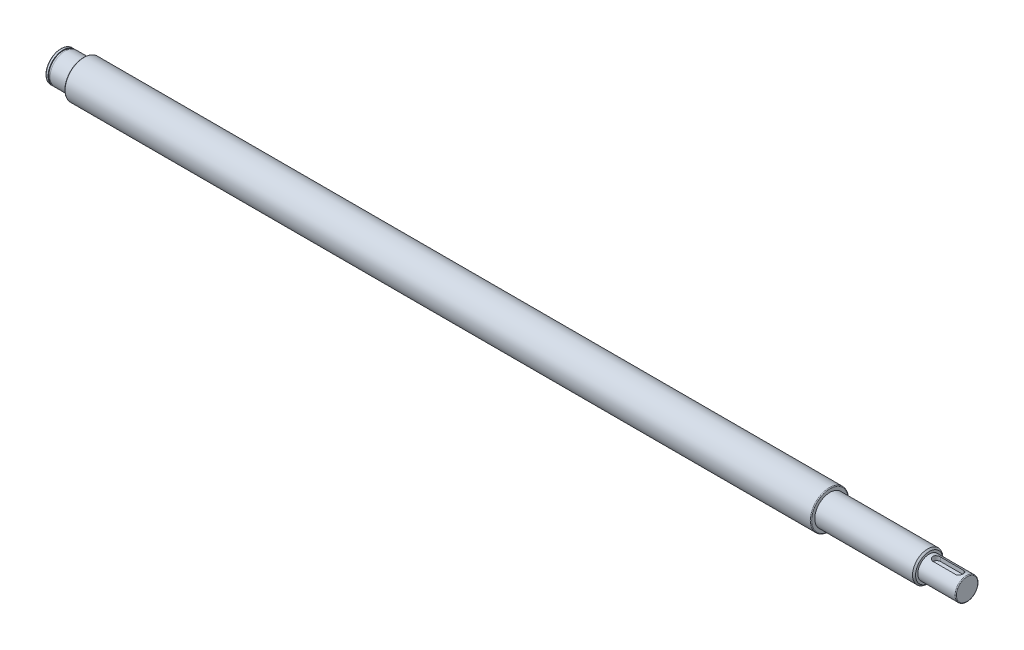
ISO-10303-21;
HEADER;
FILE_DESCRIPTION(('STEP AP214'),'2;1');
FILE_NAME('part.step','',(''),(''),'','','');
FILE_SCHEMA(('AUTOMOTIVE_DESIGN { 1 0 10303 214 1 1 1 1 }'));
ENDSEC;
DATA;
#1=APPLICATION_CONTEXT('core data for automotive mechanical design processes');
#2=APPLICATION_PROTOCOL_DEFINITION('international standard','automotive_design',2000,#1);
#3=PRODUCT_CONTEXT('',#1,'mechanical');
#4=PRODUCT('Part','Part','',(#3));
#5=PRODUCT_RELATED_PRODUCT_CATEGORY('part','',(#4));
#6=PRODUCT_DEFINITION_FORMATION('','',#4);
#7=PRODUCT_DEFINITION_CONTEXT('part definition',#1,'design');
#8=PRODUCT_DEFINITION('design','',#6,#7);
#9=PRODUCT_DEFINITION_SHAPE('','',#8);
#10=(LENGTH_UNIT() NAMED_UNIT(*) SI_UNIT(.MILLI.,.METRE.));
#11=(NAMED_UNIT(*) PLANE_ANGLE_UNIT() SI_UNIT($,.RADIAN.));
#12=(NAMED_UNIT(*) SI_UNIT($,.STERADIAN.) SOLID_ANGLE_UNIT());
#13=UNCERTAINTY_MEASURE_WITH_UNIT(LENGTH_MEASURE(1.E-05),#10,'distance_accuracy_value','');
#14=(GEOMETRIC_REPRESENTATION_CONTEXT(3) GLOBAL_UNCERTAINTY_ASSIGNED_CONTEXT((#13)) GLOBAL_UNIT_ASSIGNED_CONTEXT((#10,
#11,#12)) REPRESENTATION_CONTEXT('',''));
#15=CARTESIAN_POINT('',(0.,0.,0.));
#16=DIRECTION('',(0.,0.,1.));
#17=DIRECTION('',(1.,0.,0.));
#18=AXIS2_PLACEMENT_3D('',#15,#16,#17);
#19=CARTESIAN_POINT('',(0.,0.,0.));
#20=DIRECTION('',(-1.,0.,0.));
#21=DIRECTION('',(0.,0.,1.));
#22=AXIS2_PLACEMENT_3D('',#19,#20,#21);
#23=CYLINDRICAL_SURFACE('',#22,10.);
#24=CARTESIAN_POINT('',(3.,0.,0.));
#25=DIRECTION('',(1.,0.,0.));
#26=DIRECTION('',(0.,0.,-1.));
#27=AXIS2_PLACEMENT_3D('',#24,#25,#26);
#28=CIRCLE('',#27,10.);
#29=CARTESIAN_POINT('',(3.,0.,-10.));
#30=VERTEX_POINT('',#29);
#31=EDGE_CURVE('E74',#30,#30,#28,.T.);
#32=ORIENTED_EDGE('',*,*,#31,.T.);
#33=EDGE_LOOP('',(#32));
#34=FACE_BOUND('',#33,.T.);
#35=CARTESIAN_POINT('',(15.,0.,0.));
#36=DIRECTION('',(-1.,0.,0.));
#37=DIRECTION('',(0.,0.,1.));
#38=AXIS2_PLACEMENT_3D('',#35,#36,#37);
#39=CIRCLE('',#38,10.);
#40=CARTESIAN_POINT('',(15.,0.,10.));
#41=VERTEX_POINT('',#40);
#42=EDGE_CURVE('E115',#41,#41,#39,.T.);
#43=ORIENTED_EDGE('',*,*,#42,.T.);
#44=EDGE_LOOP('',(#43));
#45=FACE_BOUND('',#44,.T.);
#46=ADVANCED_FACE('F17',(#34,#45),#23,.T.);
#47=CARTESIAN_POINT('',(15.,10.,0.));
#48=DIRECTION('',(1.,0.,0.));
#49=DIRECTION('',(0.,0.,-1.));
#50=AXIS2_PLACEMENT_3D('',#47,#48,#49);
#51=PLANE('',#50);
#52=CARTESIAN_POINT('',(15.,0.,0.));
#53=DIRECTION('',(1.,0.,0.));
#54=DIRECTION('',(0.,0.,-1.));
#55=AXIS2_PLACEMENT_3D('',#52,#53,#54);
#56=CIRCLE('',#55,12.);
#57=CARTESIAN_POINT('',(15.,0.,-12.));
#58=VERTEX_POINT('',#57);
#59=EDGE_CURVE('E250',#58,#58,#56,.F.);
#60=ORIENTED_EDGE('',*,*,#59,.T.);
#61=EDGE_LOOP('',(#60));
#62=FACE_BOUND('',#61,.T.);
#63=ORIENTED_EDGE('',*,*,#42,.F.);
#64=EDGE_LOOP('',(#63));
#65=FACE_BOUND('',#64,.T.);
#66=ADVANCED_FACE('F163',(#62,#65),#51,.F.);
#67=CARTESIAN_POINT('',(0.,0.,0.));
#68=DIRECTION('',(-1.,0.,0.));
#69=DIRECTION('',(0.,0.,1.));
#70=AXIS2_PLACEMENT_3D('',#67,#68,#69);
#71=CYLINDRICAL_SURFACE('',#70,12.5);
#72=CARTESIAN_POINT('',(15.5,0.,0.));
#73=DIRECTION('',(1.,0.,0.));
#74=DIRECTION('',(0.,0.,-1.));
#75=AXIS2_PLACEMENT_3D('',#72,#73,#74);
#76=CIRCLE('',#75,12.5);
#77=CARTESIAN_POINT('',(15.5,0.,-12.5));
#78=VERTEX_POINT('',#77);
#79=EDGE_CURVE('E249',#78,#78,#76,.T.);
#80=ORIENTED_EDGE('',*,*,#79,.T.);
#81=EDGE_LOOP('',(#80));
#82=FACE_BOUND('',#81,.T.);
#83=CARTESIAN_POINT('',(507.,0.,0.));
#84=DIRECTION('',(-1.,0.,0.));
#85=DIRECTION('',(0.,0.,1.));
#86=AXIS2_PLACEMENT_3D('',#83,#84,#85);
#87=CIRCLE('',#86,12.5);
#88=CARTESIAN_POINT('',(507.,0.,12.5));
#89=VERTEX_POINT('',#88);
#90=EDGE_CURVE('E246',#89,#89,#87,.T.);
#91=ORIENTED_EDGE('',*,*,#90,.T.);
#92=EDGE_LOOP('',(#91));
#93=FACE_BOUND('',#92,.T.);
#94=ADVANCED_FACE('F170',(#82,#93),#71,.T.);
#95=CARTESIAN_POINT('',(507.5,12.5,0.));
#96=DIRECTION('',(-1.,0.,0.));
#97=DIRECTION('',(0.,0.,1.));
#98=AXIS2_PLACEMENT_3D('',#95,#96,#97);
#99=PLANE('',#98);
#100=CARTESIAN_POINT('',(507.5,0.,0.));
#101=DIRECTION('',(-1.,0.,0.));
#102=DIRECTION('',(0.,0.,1.));
#103=AXIS2_PLACEMENT_3D('',#100,#101,#102);
#104=CIRCLE('',#103,12.);
#105=CARTESIAN_POINT('',(507.5,0.,12.));
#106=VERTEX_POINT('',#105);
#107=EDGE_CURVE('E243',#106,#106,#104,.F.);
#108=ORIENTED_EDGE('',*,*,#107,.T.);
#109=EDGE_LOOP('',(#108));
#110=FACE_BOUND('',#109,.T.);
#111=CARTESIAN_POINT('',(507.5,0.,0.));
#112=DIRECTION('',(-1.,0.,0.));
#113=DIRECTION('',(0.,0.,1.));
#114=AXIS2_PLACEMENT_3D('',#111,#112,#113);
#115=CIRCLE('',#114,10.);
#116=CARTESIAN_POINT('',(507.5,0.,10.));
#117=VERTEX_POINT('',#116);
#118=EDGE_CURVE('E111',#117,#117,#115,.T.);
#119=ORIENTED_EDGE('',*,*,#118,.T.);
#120=EDGE_LOOP('',(#119));
#121=FACE_BOUND('',#120,.T.);
#122=ADVANCED_FACE('F279',(#110,#121),#99,.F.);
#123=CARTESIAN_POINT('',(0.,0.,0.));
#124=DIRECTION('',(-1.,0.,0.));
#125=DIRECTION('',(0.,0.,1.));
#126=AXIS2_PLACEMENT_3D('',#123,#124,#125);
#127=CYLINDRICAL_SURFACE('',#126,10.);
#128=CARTESIAN_POINT('',(572.,0.,0.));
#129=DIRECTION('',(-1.,0.,0.));
#130=DIRECTION('',(0.,0.,1.));
#131=AXIS2_PLACEMENT_3D('',#128,#129,#130);
#132=CIRCLE('',#131,10.);
#133=CARTESIAN_POINT('',(572.,0.,10.));
#134=VERTEX_POINT('',#133);
#135=EDGE_CURVE('E438',#134,#134,#132,.T.);
#136=ORIENTED_EDGE('',*,*,#135,.T.);
#137=EDGE_LOOP('',(#136));
#138=FACE_BOUND('',#137,.T.);
#139=ORIENTED_EDGE('',*,*,#118,.F.);
#140=EDGE_LOOP('',(#139));
#141=FACE_BOUND('',#140,.T.);
#142=ADVANCED_FACE('F273',(#138,#141),#127,.T.);
#143=CARTESIAN_POINT('',(573.,10.,0.));
#144=DIRECTION('',(-1.,0.,0.));
#145=DIRECTION('',(0.,0.,1.));
#146=AXIS2_PLACEMENT_3D('',#143,#144,#145);
#147=PLANE('',#146);
#148=CARTESIAN_POINT('',(573.,0.,0.));
#149=DIRECTION('',(-1.,0.,0.));
#150=DIRECTION('',(0.,0.,1.));
#151=AXIS2_PLACEMENT_3D('',#148,#149,#150);
#152=CIRCLE('',#151,8.9999999999999);
#153=CARTESIAN_POINT('',(573.,0.,8.9999999999999));
#154=VERTEX_POINT('',#153);
#155=EDGE_CURVE('E257',#154,#154,#152,.F.);
#156=ORIENTED_EDGE('',*,*,#155,.T.);
#157=EDGE_LOOP('',(#156));
#158=FACE_BOUND('',#157,.T.);
#159=CARTESIAN_POINT('',(573.,0.,0.));
#160=DIRECTION('',(-1.,0.,0.));
#161=DIRECTION('',(0.,0.,1.));
#162=AXIS2_PLACEMENT_3D('',#159,#160,#161);
#163=CIRCLE('',#162,7.5);
#164=CARTESIAN_POINT('',(573.,0.,7.5));
#165=VERTEX_POINT('',#164);
#166=EDGE_CURVE('E102',#165,#165,#163,.T.);
#167=ORIENTED_EDGE('',*,*,#166,.T.);
#168=EDGE_LOOP('',(#167));
#169=FACE_BOUND('',#168,.T.);
#170=ADVANCED_FACE('F160',(#158,#169),#147,.F.);
#171=CARTESIAN_POINT('',(0.,0.,0.));
#172=DIRECTION('',(-1.,0.,0.));
#173=DIRECTION('',(0.,0.,1.));
#174=AXIS2_PLACEMENT_3D('',#171,#172,#173);
#175=CYLINDRICAL_SURFACE('',#174,7.5);
#176=CARTESIAN_POINT('',(597.5,0.,0.));
#177=DIRECTION('',(-1.,0.,0.));
#178=DIRECTION('',(0.,0.,1.));
#179=AXIS2_PLACEMENT_3D('',#176,#177,#178);
#180=CIRCLE('',#179,7.5);
#181=CARTESIAN_POINT('',(597.5,0.,7.5));
#182=VERTEX_POINT('',#181);
#183=EDGE_CURVE('E25',#182,#182,#180,.T.);
#184=ORIENTED_EDGE('',*,*,#183,.T.);
#185=EDGE_LOOP('',(#184));
#186=FACE_BOUND('',#185,.T.);
#187=DIRECTION('',(-1.,0.,0.));
#188=VECTOR('',#187,1.);
#189=CARTESIAN_POINT('',(0.,7.07106781186549,-2.49999999999997));
#190=LINE('',#189,#188);
#191=CARTESIAN_POINT('',(578.,7.07106781186549,-2.5));
#192=VERTEX_POINT('',#191);
#193=CARTESIAN_POINT('',(593.,7.07106781186547,-2.5));
#194=VERTEX_POINT('',#193);
#195=EDGE_CURVE('E40',#192,#194,#190,.F.);
#196=ORIENTED_EDGE('',*,*,#195,.T.);
#197=CARTESIAN_POINT('',(593.,7.07106781186547,-2.5));
#198=CARTESIAN_POINT('',(593.06820707782,7.07105693273157,-2.50000899110405));
#199=CARTESIAN_POINT('',(593.136408074676,7.07205443904569,-2.49720887221585));
#200=CARTESIAN_POINT('',(593.272281038349,7.07598524121008,-2.4860604578047));
#201=CARTESIAN_POINT('',(593.339953142988,7.07891801450643,-2.47771365997201));
#202=CARTESIAN_POINT('',(593.474090488355,7.08662705252508,-2.45557459422793));
#203=CARTESIAN_POINT('',(593.540558702551,7.0913978485012,-2.44179847763131));
#204=CARTESIAN_POINT('',(593.672008268583,7.10262619906003,-2.40894181030118));
#205=CARTESIAN_POINT('',(593.73698956659,7.10908381460331,-2.38986106786033));
#206=CARTESIAN_POINT('',(593.928961579715,7.13069940793912,-2.32491551306197));
#207=CARTESIAN_POINT('',(594.05317915747,7.14811243884055,-2.27131416810238));
#208=CARTESIAN_POINT('',(594.290876811464,7.18697034087523,-2.14517784106245));
#209=CARTESIAN_POINT('',(594.404350235781,7.20841768551075,-2.07263123268537));
#210=CARTESIAN_POINT('',(594.621792903471,7.25386182389477,-1.90762995846821));
#211=CARTESIAN_POINT('',(594.725285142768,7.2779218942807,-1.81456284630818));
#212=CARTESIAN_POINT('',(594.915517103234,7.32534626726043,-1.61247071190493));
#213=CARTESIAN_POINT('',(595.002253841319,7.3487104453352,-1.50344285413652));
#214=CARTESIAN_POINT('',(595.158698224263,7.39284706096344,-1.26900922493973));
#215=CARTESIAN_POINT('',(595.227902307742,7.41353593532889,-1.14325025284455));
#216=CARTESIAN_POINT('',(595.343980782435,7.4492402188328,-0.8810730954752));
#217=CARTESIAN_POINT('',(595.390861994926,7.46425736081205,-0.744658181225826));
#218=CARTESIAN_POINT('',(595.459339276258,7.48647677762783,-0.47007337118288));
#219=CARTESIAN_POINT('',(595.481758170957,7.49393272446142,-0.332129588153714));
#220=CARTESIAN_POINT('',(595.503290756739,7.50109021034827,-0.0542474216361666));
#221=CARTESIAN_POINT('',(595.502410000916,7.50079359709905,0.0856904786402524));
#222=CARTESIAN_POINT('',(595.4778892896,7.49265096581776,0.357759612692359));
#223=CARTESIAN_POINT('',(595.455143404395,7.48510152476447,0.489981756428048));
#224=CARTESIAN_POINT('',(595.389017004021,7.46367401253772,0.748610161077215));
#225=CARTESIAN_POINT('',(595.345635344675,7.44979559044789,0.875016099077747));
#226=CARTESIAN_POINT('',(595.238946575806,7.41689170677794,1.12038155754031));
#227=CARTESIAN_POINT('',(595.175384887143,7.39780094595659,1.23922126412485));
#228=CARTESIAN_POINT('',(595.030350121575,7.35645969200238,1.4648114727535));
#229=CARTESIAN_POINT('',(594.948872172398,7.33420833994017,1.57155867428944));
#230=CARTESIAN_POINT('',(594.765822374993,7.28765679856813,1.77524334927518));
#231=CARTESIAN_POINT('',(594.663486140972,7.2633094669978,1.87148402903081));
#232=CARTESIAN_POINT('',(594.443896275714,7.21618726182143,2.04568006205152));
#233=CARTESIAN_POINT('',(594.326637843993,7.19341289789387,2.12362950795968));
#234=CARTESIAN_POINT('',(594.078299554116,7.1517507844079,2.26000831398181));
#235=CARTESIAN_POINT('',(593.947041212668,7.13292537370585,2.31813252376916));
#236=CARTESIAN_POINT('',(593.675882556025,7.10202742655099,2.41115057675281));
#237=CARTESIAN_POINT('',(593.53599626657,7.08994423522483,2.44608109013839));
#238=CARTESIAN_POINT('',(593.32895340813,7.078413552368,2.47914539070207));
#239=CARTESIAN_POINT('',(593.263396525364,7.07566669236505,2.48696265313779));
#240=CARTESIAN_POINT('',(593.131904804,7.07199258928497,2.497386540178));
#241=CARTESIAN_POINT('',(593.065970563639,7.0710629982382,2.49999988848745));
#242=CARTESIAN_POINT('',(593.,7.07106781186548,2.5));
#243=B_SPLINE_CURVE_WITH_KNOTS('',3,(#197,#198,#199,#200,#201,#202,#203,#204,#205,#206,#207,
#208,#209,#210,#211,#212,#213,#214,#215,#216,#217,#218,#219,#220,#221,#222,#223,#224,#225,#226,
#227,#228,#229,#230,#231,#232,#233,#234,#235,#236,#237,#238,#239,#240,#241,#242),.UNSPECIFIED.,
.F.,.F.,(4,2,2,2,2,2,2,2,2,2,2,2,2,2,2,2,2,2,2,2,2,2,4),(0.,0.204546211838768,0.409037215423831,
0.612924429429257,0.816819012805585,1.22401016923283,1.63145179965567,2.05327864088414,
2.47518051341089,2.90809434014468,3.34087579484531,3.75860278500218,4.17623021758312,
4.5774764784604,4.97874498952319,5.38529148746617,5.79194868153616,6.21771736826816,
6.64362337304799,7.07581676501824,7.50732520398836,7.70536340013626,7.90314555504367),.UNSPECIFIED.);
#244=CARTESIAN_POINT('',(593.,7.07106781186547,2.5));
#245=VERTEX_POINT('',#244);
#246=EDGE_CURVE('E118',#194,#245,#243,.T.);
#247=ORIENTED_EDGE('',*,*,#246,.T.);
#248=DIRECTION('',(-1.,0.,0.));
#249=VECTOR('',#248,1.);
#250=CARTESIAN_POINT('',(0.,7.07106781186547,2.5));
#251=LINE('',#250,#249);
#252=CARTESIAN_POINT('',(578.,7.07106781186547,2.5));
#253=VERTEX_POINT('',#252);
#254=EDGE_CURVE('E437',#245,#253,#251,.T.);
#255=ORIENTED_EDGE('',*,*,#254,.T.);
#256=CARTESIAN_POINT('',(578.,7.07106781186548,2.5));
#257=CARTESIAN_POINT('',(577.93179292218,7.07105693273158,2.50000899110404));
#258=CARTESIAN_POINT('',(577.863591925324,7.0720544390457,2.49720887221583));
#259=CARTESIAN_POINT('',(577.727718961651,7.07598524121008,2.48606045780469));
#260=CARTESIAN_POINT('',(577.660046857012,7.07891801450643,2.477713659972));
#261=CARTESIAN_POINT('',(577.525909511645,7.08662705252508,2.45557459422791));
#262=CARTESIAN_POINT('',(577.459441297449,7.09139784850121,2.44179847763129));
#263=CARTESIAN_POINT('',(577.327991731417,7.10262619906004,2.40894181030116));
#264=CARTESIAN_POINT('',(577.26301043341,7.10908381460331,2.38986106786031));
#265=CARTESIAN_POINT('',(577.071038420285,7.13069940793911,2.32491551306195));
#266=CARTESIAN_POINT('',(576.94682084253,7.14811243884055,2.27131416810237));
#267=CARTESIAN_POINT('',(576.709123188536,7.18697034087524,2.14517784106243));
#268=CARTESIAN_POINT('',(576.595649764219,7.20841768551076,2.07263123268534));
#269=CARTESIAN_POINT('',(576.378207096529,7.25386182389479,1.90762995846818));
#270=CARTESIAN_POINT('',(576.274714857232,7.27792189428071,1.81456284630814));
#271=CARTESIAN_POINT('',(576.084482896766,7.32534626726043,1.61247071190489));
#272=CARTESIAN_POINT('',(575.997746158681,7.3487104453352,1.50344285413648));
#273=CARTESIAN_POINT('',(575.841301775737,7.39284706096344,1.26900922493969));
#274=CARTESIAN_POINT('',(575.772097692258,7.41353593532889,1.1432502528445));
#275=CARTESIAN_POINT('',(575.656019217565,7.4492402188328,0.881073095475156));
#276=CARTESIAN_POINT('',(575.609138005074,7.46425736081205,0.744658181225797));
#277=CARTESIAN_POINT('',(575.540660723742,7.48647677762783,0.470073371182869));
#278=CARTESIAN_POINT('',(575.518241829043,7.49393272446142,0.332129588153705));
#279=CARTESIAN_POINT('',(575.496709243261,7.50109021034827,0.0542474216361628));
#280=CARTESIAN_POINT('',(575.497589999084,7.50079359709905,-0.0856904786402541));
#281=CARTESIAN_POINT('',(575.5221107104,7.49265096581776,-0.357759612692388));
#282=CARTESIAN_POINT('',(575.544856595605,7.48510152476447,-0.489981756428104));
#283=CARTESIAN_POINT('',(575.610982995979,7.46367401253772,-0.748610161077275));
#284=CARTESIAN_POINT('',(575.654364655325,7.44979559044789,-0.875016099077785));
#285=CARTESIAN_POINT('',(575.761053424194,7.41689170677794,-1.12038155754031));
#286=CARTESIAN_POINT('',(575.824615112857,7.3978009459566,-1.23922126412483));
#287=CARTESIAN_POINT('',(575.969649878425,7.35645969200239,-1.46481147275349));
#288=CARTESIAN_POINT('',(576.051127827602,7.33420833994016,-1.57155867428944));
#289=CARTESIAN_POINT('',(576.234177625007,7.28765679856812,-1.77524334927523));
#290=CARTESIAN_POINT('',(576.336513859028,7.26330946699779,-1.87148402903086));
#291=CARTESIAN_POINT('',(576.556103724286,7.21618726182142,-2.04568006205156));
#292=CARTESIAN_POINT('',(576.673362156007,7.19341289789386,-2.12362950795971));
#293=CARTESIAN_POINT('',(576.921700445884,7.15175078440789,-2.26000831398183));
#294=CARTESIAN_POINT('',(577.052958787332,7.13292537370585,-2.31813252376918));
#295=CARTESIAN_POINT('',(577.324117443975,7.10202742655099,-2.41115057675283));
#296=CARTESIAN_POINT('',(577.46400373343,7.08994423522482,-2.4460810901384));
#297=CARTESIAN_POINT('',(577.67104659187,7.07841355236799,-2.47914539070208));
#298=CARTESIAN_POINT('',(577.736603474636,7.07566669236504,-2.4869626531378));
#299=CARTESIAN_POINT('',(577.868095196,7.07199258928497,-2.49738654017801));
#300=CARTESIAN_POINT('',(577.934029436361,7.0710629982382,-2.49999988848746));
#301=CARTESIAN_POINT('',(578.,7.07106781186547,-2.5));
#302=B_SPLINE_CURVE_WITH_KNOTS('',3,(#256,#257,#258,#259,#260,#261,#262,#263,#264,#265,#266,
#267,#268,#269,#270,#271,#272,#273,#274,#275,#276,#277,#278,#279,#280,#281,#282,#283,#284,#285,
#286,#287,#288,#289,#290,#291,#292,#293,#294,#295,#296,#297,#298,#299,#300,#301),.UNSPECIFIED.,
.F.,.F.,(4,2,2,2,2,2,2,2,2,2,2,2,2,2,2,2,2,2,2,2,2,2,4),(0.,0.204546211838657,0.409037215423831,
0.612924429429258,0.816819012805586,1.22401016923283,1.63145179965567,2.05327864088426,
2.4751805134109,2.90809434014472,3.34087579484532,3.75860278500216,4.17623021758313,
4.57747647846042,4.97874498952316,5.3852914874661,5.79194868153613,6.21771736826825,
6.64362337304795,7.0758167650182,7.50732520398832,7.70536340013611,7.90314555504363),.UNSPECIFIED.);
#303=EDGE_CURVE('E32',#253,#192,#302,.T.);
#304=ORIENTED_EDGE('',*,*,#303,.T.);
#305=EDGE_LOOP('',(#196,#247,#255,#304));
#306=FACE_BOUND('',#305,.T.);
#307=ORIENTED_EDGE('',*,*,#166,.F.);
#308=EDGE_LOOP('',(#307));
#309=FACE_BOUND('',#308,.T.);
#310=ADVANCED_FACE('F133',(#186,#306,#309),#175,.T.);
#311=CARTESIAN_POINT('',(598.,7.5,0.));
#312=DIRECTION('',(-1.,0.,0.));
#313=DIRECTION('',(0.,0.,1.));
#314=AXIS2_PLACEMENT_3D('',#311,#312,#313);
#315=PLANE('',#314);
#316=CARTESIAN_POINT('',(598.,0.,0.));
#317=DIRECTION('',(-1.,0.,0.));
#318=DIRECTION('',(0.,0.,1.));
#319=AXIS2_PLACEMENT_3D('',#316,#317,#318);
#320=CIRCLE('',#319,7.);
#321=CARTESIAN_POINT('',(598.,0.,7.));
#322=VERTEX_POINT('',#321);
#323=EDGE_CURVE('E11',#322,#322,#320,.F.);
#324=ORIENTED_EDGE('',*,*,#323,.T.);
#325=EDGE_LOOP('',(#324));
#326=FACE_BOUND('',#325,.T.);
#327=ADVANCED_FACE('F152',(#326),#315,.F.);
#328=CARTESIAN_POINT('',(578.,4.5,0.));
#329=DIRECTION('',(0.,1.,0.));
#330=DIRECTION('',(0.,0.,1.));
#331=AXIS2_PLACEMENT_3D('',#328,#329,#330);
#332=CYLINDRICAL_SURFACE('',#331,2.5);
#333=DIRECTION('',(0.,1.,0.));
#334=VECTOR('',#333,1.);
#335=CARTESIAN_POINT('',(578.,4.5,2.5));
#336=LINE('',#335,#334);
#337=CARTESIAN_POINT('',(578.,4.5,2.5));
#338=VERTEX_POINT('',#337);
#339=EDGE_CURVE('E99',#338,#253,#336,.T.);
#340=ORIENTED_EDGE('',*,*,#339,.F.);
#341=CARTESIAN_POINT('',(578.,4.5,0.));
#342=DIRECTION('',(0.,1.,0.));
#343=DIRECTION('',(0.,0.,1.));
#344=AXIS2_PLACEMENT_3D('',#341,#342,#343);
#345=CIRCLE('',#344,2.5);
#346=CARTESIAN_POINT('',(578.,4.5,-2.5));
#347=VERTEX_POINT('',#346);
#348=EDGE_CURVE('E87',#347,#338,#345,.T.);
#349=ORIENTED_EDGE('',*,*,#348,.F.);
#350=DIRECTION('',(0.,1.,0.));
#351=VECTOR('',#350,1.);
#352=CARTESIAN_POINT('',(578.,4.5,-2.5));
#353=LINE('',#352,#351);
#354=EDGE_CURVE('E100',#347,#192,#353,.T.);
#355=ORIENTED_EDGE('',*,*,#354,.T.);
#356=ORIENTED_EDGE('',*,*,#303,.F.);
#357=EDGE_LOOP('',(#340,#349,#355,#356));
#358=FACE_BOUND('',#357,.T.);
#359=ADVANCED_FACE('F149',(#358),#332,.F.);
#360=CARTESIAN_POINT('',(578.,4.5,-2.5));
#361=DIRECTION('',(0.,0.,-1.));
#362=DIRECTION('',(-1.,0.,0.));
#363=AXIS2_PLACEMENT_3D('',#360,#361,#362);
#364=PLANE('',#363);
#365=ORIENTED_EDGE('',*,*,#354,.F.);
#366=DIRECTION('',(-1.,0.,0.));
#367=VECTOR('',#366,1.);
#368=CARTESIAN_POINT('',(578.,4.5,-2.5));
#369=LINE('',#368,#367);
#370=CARTESIAN_POINT('',(593.,4.5,-2.5));
#371=VERTEX_POINT('',#370);
#372=EDGE_CURVE('E96',#371,#347,#369,.T.);
#373=ORIENTED_EDGE('',*,*,#372,.F.);
#374=DIRECTION('',(0.,1.,0.));
#375=VECTOR('',#374,1.);
#376=CARTESIAN_POINT('',(593.,4.5,-2.5));
#377=LINE('',#376,#375);
#378=EDGE_CURVE('E103',#371,#194,#377,.T.);
#379=ORIENTED_EDGE('',*,*,#378,.T.);
#380=ORIENTED_EDGE('',*,*,#195,.F.);
#381=EDGE_LOOP('',(#365,#373,#379,#380));
#382=FACE_BOUND('',#381,.T.);
#383=ADVANCED_FACE('F143',(#382),#364,.F.);
#384=CARTESIAN_POINT('',(593.,4.5,0.));
#385=DIRECTION('',(0.,1.,0.));
#386=DIRECTION('',(0.,0.,1.));
#387=AXIS2_PLACEMENT_3D('',#384,#385,#386);
#388=CYLINDRICAL_SURFACE('',#387,2.5);
#389=ORIENTED_EDGE('',*,*,#378,.F.);
#390=CARTESIAN_POINT('',(593.,4.5,0.));
#391=DIRECTION('',(0.,1.,0.));
#392=DIRECTION('',(0.,0.,1.));
#393=AXIS2_PLACEMENT_3D('',#390,#391,#392);
#394=CIRCLE('',#393,2.5);
#395=CARTESIAN_POINT('',(593.,4.5,2.5));
#396=VERTEX_POINT('',#395);
#397=EDGE_CURVE('E93',#396,#371,#394,.T.);
#398=ORIENTED_EDGE('',*,*,#397,.F.);
#399=DIRECTION('',(0.,1.,0.));
#400=VECTOR('',#399,1.);
#401=CARTESIAN_POINT('',(593.,4.5,2.5));
#402=LINE('',#401,#400);
#403=EDGE_CURVE('E105',#396,#245,#402,.T.);
#404=ORIENTED_EDGE('',*,*,#403,.T.);
#405=ORIENTED_EDGE('',*,*,#246,.F.);
#406=EDGE_LOOP('',(#389,#398,#404,#405));
#407=FACE_BOUND('',#406,.T.);
#408=ADVANCED_FACE('F137',(#407),#388,.F.);
#409=CARTESIAN_POINT('',(578.,4.5,2.5));
#410=DIRECTION('',(0.,0.,1.));
#411=DIRECTION('',(1.,0.,0.));
#412=AXIS2_PLACEMENT_3D('',#409,#410,#411);
#413=PLANE('',#412);
#414=ORIENTED_EDGE('',*,*,#403,.F.);
#415=DIRECTION('',(1.,0.,0.));
#416=VECTOR('',#415,1.);
#417=CARTESIAN_POINT('',(578.,4.5,2.5));
#418=LINE('',#417,#416);
#419=EDGE_CURVE('E90',#338,#396,#418,.T.);
#420=ORIENTED_EDGE('',*,*,#419,.F.);
#421=ORIENTED_EDGE('',*,*,#339,.T.);
#422=ORIENTED_EDGE('',*,*,#254,.F.);
#423=EDGE_LOOP('',(#414,#420,#421,#422));
#424=FACE_BOUND('',#423,.T.);
#425=ADVANCED_FACE('F142',(#424),#413,.F.);
#426=CARTESIAN_POINT('',(578.,4.5,0.));
#427=DIRECTION('',(0.,1.,0.));
#428=DIRECTION('',(0.,0.,1.));
#429=AXIS2_PLACEMENT_3D('',#426,#427,#428);
#430=PLANE('',#429);
#431=ORIENTED_EDGE('',*,*,#348,.T.);
#432=ORIENTED_EDGE('',*,*,#419,.T.);
#433=ORIENTED_EDGE('',*,*,#397,.T.);
#434=ORIENTED_EDGE('',*,*,#372,.T.);
#435=EDGE_LOOP('',(#431,#432,#433,#434));
#436=FACE_BOUND('',#435,.T.);
#437=ADVANCED_FACE('F147',(#436),#430,.T.);
#438=CARTESIAN_POINT('',(1.7,0.,-10.));
#439=DIRECTION('',(-1.,0.,0.));
#440=DIRECTION('',(0.,0.,1.));
#441=AXIS2_PLACEMENT_3D('',#438,#439,#440);
#442=PLANE('',#441);
#443=CARTESIAN_POINT('',(1.7,0.,0.));
#444=DIRECTION('',(1.,0.,0.));
#445=DIRECTION('',(0.,0.,-1.));
#446=AXIS2_PLACEMENT_3D('',#443,#444,#445);
#447=CIRCLE('',#446,9.5);
#448=CARTESIAN_POINT('',(1.7,0.,-9.5));
#449=VERTEX_POINT('',#448);
#450=EDGE_CURVE('E84',#449,#449,#447,.T.);
#451=ORIENTED_EDGE('',*,*,#450,.F.);
#452=EDGE_LOOP('',(#451));
#453=FACE_BOUND('',#452,.T.);
#454=CARTESIAN_POINT('',(1.7,0.,0.));
#455=DIRECTION('',(1.,0.,0.));
#456=DIRECTION('',(0.,0.,-1.));
#457=AXIS2_PLACEMENT_3D('',#454,#455,#456);
#458=CIRCLE('',#457,10.);
#459=CARTESIAN_POINT('',(1.7,0.,-10.));
#460=VERTEX_POINT('',#459);
#461=EDGE_CURVE('E70',#460,#460,#458,.T.);
#462=ORIENTED_EDGE('',*,*,#461,.T.);
#463=EDGE_LOOP('',(#462));
#464=FACE_BOUND('',#463,.T.);
#465=ADVANCED_FACE('F190',(#453,#464),#442,.F.);
#466=CARTESIAN_POINT('',(0.,0.,0.));
#467=DIRECTION('',(1.,0.,0.));
#468=DIRECTION('',(0.,0.,-1.));
#469=AXIS2_PLACEMENT_3D('',#466,#467,#468);
#470=CYLINDRICAL_SURFACE('',#469,9.5);
#471=CARTESIAN_POINT('',(3.,0.,0.));
#472=DIRECTION('',(1.,0.,0.));
#473=DIRECTION('',(0.,0.,-1.));
#474=AXIS2_PLACEMENT_3D('',#471,#472,#473);
#475=CIRCLE('',#474,9.5);
#476=CARTESIAN_POINT('',(3.,0.,-9.5));
#477=VERTEX_POINT('',#476);
#478=EDGE_CURVE('E81',#477,#477,#475,.T.);
#479=ORIENTED_EDGE('',*,*,#478,.F.);
#480=EDGE_LOOP('',(#479));
#481=FACE_BOUND('',#480,.T.);
#482=ORIENTED_EDGE('',*,*,#450,.T.);
#483=EDGE_LOOP('',(#482));
#484=FACE_BOUND('',#483,.T.);
#485=ADVANCED_FACE('F192',(#481,#484),#470,.T.);
#486=CARTESIAN_POINT('',(3.,0.,-10.));
#487=DIRECTION('',(1.,0.,0.));
#488=DIRECTION('',(0.,0.,-1.));
#489=AXIS2_PLACEMENT_3D('',#486,#487,#488);
#490=PLANE('',#489);
#491=ORIENTED_EDGE('',*,*,#31,.F.);
#492=EDGE_LOOP('',(#491));
#493=FACE_BOUND('',#492,.T.);
#494=ORIENTED_EDGE('',*,*,#478,.T.);
#495=EDGE_LOOP('',(#494));
#496=FACE_BOUND('',#495,.T.);
#497=ADVANCED_FACE('F182',(#493,#496),#490,.F.);
#498=CARTESIAN_POINT('',(0.,0.,0.));
#499=DIRECTION('',(1.,0.,0.));
#500=DIRECTION('',(0.,0.,-1.));
#501=AXIS2_PLACEMENT_3D('',#498,#499,#500);
#502=PLANE('',#501);
#503=CARTESIAN_POINT('',(0.,0.,0.));
#504=DIRECTION('',(1.,0.,0.));
#505=DIRECTION('',(0.,0.,-1.));
#506=AXIS2_PLACEMENT_3D('',#503,#504,#505);
#507=CIRCLE('',#506,9.5);
#508=CARTESIAN_POINT('',(0.,0.,-9.5));
#509=VERTEX_POINT('',#508);
#510=EDGE_CURVE('E254',#509,#509,#507,.F.);
#511=ORIENTED_EDGE('',*,*,#510,.T.);
#512=EDGE_LOOP('',(#511));
#513=FACE_BOUND('',#512,.T.);
#514=CARTESIAN_POINT('',(0.,0.,0.));
#515=DIRECTION('',(-1.,0.,0.));
#516=DIRECTION('',(0.,0.,1.));
#517=AXIS2_PLACEMENT_3D('',#514,#515,#516);
#518=CIRCLE('',#517,2.5);
#519=CARTESIAN_POINT('',(0.,0.,2.5));
#520=VERTEX_POINT('',#519);
#521=EDGE_CURVE('E71',#520,#520,#518,.T.);
#522=ORIENTED_EDGE('',*,*,#521,.F.);
#523=EDGE_LOOP('',(#522));
#524=FACE_BOUND('',#523,.T.);
#525=ADVANCED_FACE('F176',(#513,#524),#502,.F.);
#526=CARTESIAN_POINT('',(0.5,0.,0.));
#527=DIRECTION('',(1.,0.,0.));
#528=DIRECTION('',(0.,0.,-1.));
#529=AXIS2_PLACEMENT_3D('',#526,#527,#528);
#530=CIRCLE('',#529,10.);
#531=CARTESIAN_POINT('',(0.5,0.,-10.));
#532=VERTEX_POINT('',#531);
#533=EDGE_CURVE('E187',#532,#532,#530,.T.);
#534=ORIENTED_EDGE('',*,*,#533,.T.);
#535=EDGE_LOOP('',(#534));
#536=FACE_BOUND('',#535,.T.);
#537=ORIENTED_EDGE('',*,*,#461,.F.);
#538=EDGE_LOOP('',(#537));
#539=FACE_BOUND('',#538,.T.);
#540=ADVANCED_FACE('F64',(#536,#539),#23,.T.);
#541=CARTESIAN_POINT('',(17.,0.,0.));
#542=DIRECTION('',(-1.,0.,0.));
#543=DIRECTION('',(0.,0.,1.));
#544=AXIS2_PLACEMENT_3D('',#541,#542,#543);
#545=CONICAL_SURFACE('',#544,2.5,1.02974425867665);
#546=CARTESIAN_POINT('',(18.5021515475689,0.,0.));
#547=VERTEX_POINT('',#546);
#548=VERTEX_LOOP('',#547);
#549=FACE_BOUND('',#548,.T.);
#550=CARTESIAN_POINT('',(17.,0.,0.));
#551=DIRECTION('',(-1.,0.,0.));
#552=DIRECTION('',(0.,0.,1.));
#553=AXIS2_PLACEMENT_3D('',#550,#551,#552);
#554=CIRCLE('',#553,2.5);
#555=CARTESIAN_POINT('',(17.,0.,2.5));
#556=VERTEX_POINT('',#555);
#557=EDGE_CURVE('E68',#556,#556,#554,.T.);
#558=ORIENTED_EDGE('',*,*,#557,.T.);
#559=EDGE_LOOP('',(#558));
#560=FACE_BOUND('',#559,.T.);
#561=ADVANCED_FACE('F60',(#549,#560),#545,.F.);
#562=CARTESIAN_POINT('',(0.,0.,0.));
#563=DIRECTION('',(-1.,0.,0.));
#564=DIRECTION('',(0.,0.,1.));
#565=AXIS2_PLACEMENT_3D('',#562,#563,#564);
#566=CYLINDRICAL_SURFACE('',#565,2.5);
#567=ORIENTED_EDGE('',*,*,#557,.F.);
#568=EDGE_LOOP('',(#567));
#569=FACE_BOUND('',#568,.T.);
#570=ORIENTED_EDGE('',*,*,#521,.T.);
#571=EDGE_LOOP('',(#570));
#572=FACE_BOUND('',#571,.T.);
#573=ADVANCED_FACE('F63',(#569,#572),#566,.F.);
#574=CARTESIAN_POINT('',(572.,0.,0.));
#575=DIRECTION('',(-1.,0.,0.));
#576=DIRECTION('',(0.,0.,1.));
#577=AXIS2_PLACEMENT_3D('',#574,#575,#576);
#578=CONICAL_SURFACE('',#577,10.,0.785398163397444);
#579=ORIENTED_EDGE('',*,*,#155,.F.);
#580=EDGE_LOOP('',(#579));
#581=FACE_BOUND('',#580,.T.);
#582=ORIENTED_EDGE('',*,*,#135,.F.);
#583=EDGE_LOOP('',(#582));
#584=FACE_BOUND('',#583,.T.);
#585=ADVANCED_FACE('F209',(#581,#584),#578,.T.);
#586=CARTESIAN_POINT('',(15.5,0.,0.));
#587=DIRECTION('',(1.,0.,0.));
#588=DIRECTION('',(0.,0.,-1.));
#589=AXIS2_PLACEMENT_3D('',#586,#587,#588);
#590=TOROIDAL_SURFACE('',#589,12.,0.5);
#591=ORIENTED_EDGE('',*,*,#79,.F.);
#592=EDGE_LOOP('',(#591));
#593=FACE_BOUND('',#592,.T.);
#594=ORIENTED_EDGE('',*,*,#59,.F.);
#595=EDGE_LOOP('',(#594));
#596=FACE_BOUND('',#595,.T.);
#597=ADVANCED_FACE('F214',(#593,#596),#590,.T.);
#598=CARTESIAN_POINT('',(0.5,0.,0.));
#599=DIRECTION('',(1.,0.,0.));
#600=DIRECTION('',(0.,0.,-1.));
#601=AXIS2_PLACEMENT_3D('',#598,#599,#600);
#602=TOROIDAL_SURFACE('',#601,9.5,0.5);
#603=ORIENTED_EDGE('',*,*,#533,.F.);
#604=EDGE_LOOP('',(#603));
#605=FACE_BOUND('',#604,.T.);
#606=ORIENTED_EDGE('',*,*,#510,.F.);
#607=EDGE_LOOP('',(#606));
#608=FACE_BOUND('',#607,.T.);
#609=ADVANCED_FACE('F224',(#605,#608),#602,.T.);
#610=CARTESIAN_POINT('',(507.,0.,0.));
#611=DIRECTION('',(-1.,0.,0.));
#612=DIRECTION('',(0.,0.,1.));
#613=AXIS2_PLACEMENT_3D('',#610,#611,#612);
#614=TOROIDAL_SURFACE('',#613,12.,0.5);
#615=ORIENTED_EDGE('',*,*,#107,.F.);
#616=EDGE_LOOP('',(#615));
#617=FACE_BOUND('',#616,.T.);
#618=ORIENTED_EDGE('',*,*,#90,.F.);
#619=EDGE_LOOP('',(#618));
#620=FACE_BOUND('',#619,.T.);
#621=ADVANCED_FACE('F231',(#617,#620),#614,.T.);
#622=CARTESIAN_POINT('',(597.5,0.,0.));
#623=DIRECTION('',(-1.,0.,0.));
#624=DIRECTION('',(0.,0.,1.));
#625=AXIS2_PLACEMENT_3D('',#622,#623,#624);
#626=TOROIDAL_SURFACE('',#625,7.,0.5);
#627=ORIENTED_EDGE('',*,*,#323,.F.);
#628=EDGE_LOOP('',(#627));
#629=FACE_BOUND('',#628,.T.);
#630=ORIENTED_EDGE('',*,*,#183,.F.);
#631=EDGE_LOOP('',(#630));
#632=FACE_BOUND('',#631,.T.);
#633=ADVANCED_FACE('F19',(#629,#632),#626,.T.);
#634=CLOSED_SHELL('',(#46,#66,#94,#122,#142,#170,#310,#327,#359,#383,#408,#425,#437,#465,#485,
#497,#525,#540,#561,#573,#585,#597,#609,#621,#633));
#635=MANIFOLD_SOLID_BREP('B1',#634);
#636=ADVANCED_BREP_SHAPE_REPRESENTATION('',(#18,#635),#14);
#637=SHAPE_DEFINITION_REPRESENTATION(#9,#636);
ENDSEC;
END-ISO-10303-21;
